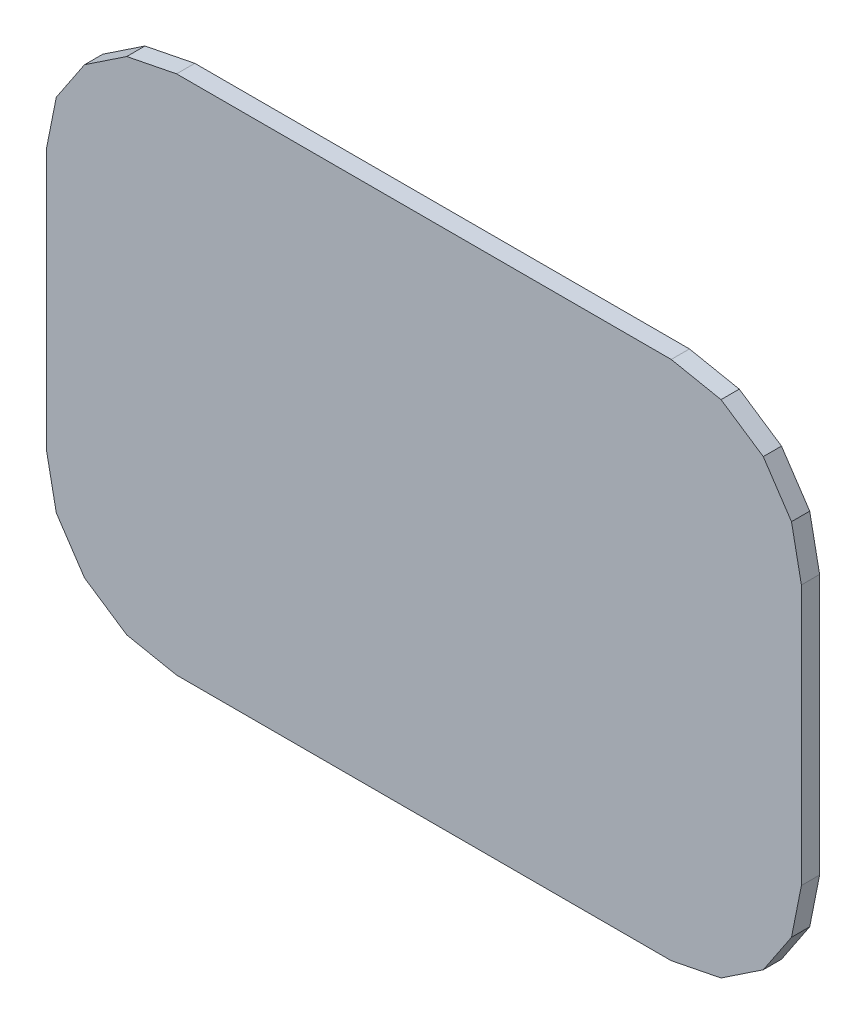
ISO-10303-21;
HEADER;
FILE_DESCRIPTION(('STEP AP214'),'2;1');
FILE_NAME('part.step','',(''),(''),'','','');
FILE_SCHEMA(('AUTOMOTIVE_DESIGN { 1 0 10303 214 1 1 1 1 }'));
ENDSEC;
DATA;
#1=APPLICATION_CONTEXT('core data for automotive mechanical design processes');
#2=APPLICATION_PROTOCOL_DEFINITION('international standard','automotive_design',2000,#1);
#3=PRODUCT_CONTEXT('',#1,'mechanical');
#4=PRODUCT('Part','Part','',(#3));
#5=PRODUCT_RELATED_PRODUCT_CATEGORY('part','',(#4));
#6=PRODUCT_DEFINITION_FORMATION('','',#4);
#7=PRODUCT_DEFINITION_CONTEXT('part definition',#1,'design');
#8=PRODUCT_DEFINITION('design','',#6,#7);
#9=PRODUCT_DEFINITION_SHAPE('','',#8);
#10=(LENGTH_UNIT() NAMED_UNIT(*) SI_UNIT(.MILLI.,.METRE.));
#11=(NAMED_UNIT(*) PLANE_ANGLE_UNIT() SI_UNIT($,.RADIAN.));
#12=(NAMED_UNIT(*) SI_UNIT($,.STERADIAN.) SOLID_ANGLE_UNIT());
#13=UNCERTAINTY_MEASURE_WITH_UNIT(LENGTH_MEASURE(1.E-05),#10,'distance_accuracy_value','');
#14=(GEOMETRIC_REPRESENTATION_CONTEXT(3) GLOBAL_UNCERTAINTY_ASSIGNED_CONTEXT((#13)) GLOBAL_UNIT_ASSIGNED_CONTEXT((#10,
#11,#12)) REPRESENTATION_CONTEXT('',''));
#15=CARTESIAN_POINT('',(0.,0.,0.));
#16=DIRECTION('',(0.,0.,1.));
#17=DIRECTION('',(1.,0.,0.));
#18=AXIS2_PLACEMENT_3D('',#15,#16,#17);
#19=CARTESIAN_POINT('',(104.265499,-66.119999,1.635));
#20=DIRECTION('',(0.,0.,-1.));
#21=DIRECTION('',(0.,-1.,0.));
#22=AXIS2_PLACEMENT_3D('',#19,#20,#21);
#23=PLANE('',#22);
#24=DIRECTION('',(0.980785565024887,-0.195088891120977,0.));
#25=VECTOR('',#24,1.);
#26=CARTESIAN_POINT('',(104.740499,-65.619999,1.635));
#27=LINE('',#26,#25);
#28=CARTESIAN_POINT('',(104.740499,-65.619999,1.635));
#29=VERTEX_POINT('',#28);
#30=CARTESIAN_POINT('',(104.83617,-65.639029,1.635));
#31=VERTEX_POINT('',#30);
#32=EDGE_CURVE('E20',#29,#31,#27,.T.);
#33=ORIENTED_EDGE('',*,*,#32,.F.);
#34=DIRECTION('',(1.,0.,0.));
#35=VECTOR('',#34,1.);
#36=CARTESIAN_POINT('',(103.790499,-65.619999,1.635));
#37=LINE('',#36,#35);
#38=CARTESIAN_POINT('',(103.790499,-65.619999,1.635));
#39=VERTEX_POINT('',#38);
#40=EDGE_CURVE('E374',#39,#29,#37,.T.);
#41=ORIENTED_EDGE('',*,*,#40,.F.);
#42=DIRECTION('',(0.980785565024887,0.195088891120977,0.));
#43=VECTOR('',#42,1.);
#44=CARTESIAN_POINT('',(103.694828,-65.639029,1.635));
#45=LINE('',#44,#43);
#46=CARTESIAN_POINT('',(103.694828,-65.639029,1.635));
#47=VERTEX_POINT('',#46);
#48=EDGE_CURVE('E405',#47,#39,#45,.T.);
#49=ORIENTED_EDGE('',*,*,#48,.F.);
#50=DIRECTION('',(0.831471016926906,0.555568130844937,0.));
#51=VECTOR('',#50,1.);
#52=CARTESIAN_POINT('',(103.613722,-65.693222,1.635));
#53=LINE('',#52,#51);
#54=CARTESIAN_POINT('',(103.613722,-65.693222,1.635));
#55=VERTEX_POINT('',#54);
#56=EDGE_CURVE('E393',#55,#47,#53,.T.);
#57=ORIENTED_EDGE('',*,*,#56,.F.);
#58=DIRECTION('',(0.555568130844937,0.831471016926906,0.));
#59=VECTOR('',#58,1.);
#60=CARTESIAN_POINT('',(103.559529,-65.774328,1.635));
#61=LINE('',#60,#59);
#62=CARTESIAN_POINT('',(103.559529,-65.774328,1.635));
#63=VERTEX_POINT('',#62);
#64=EDGE_CURVE('E381',#63,#55,#61,.T.);
#65=ORIENTED_EDGE('',*,*,#64,.F.);
#66=DIRECTION('',(0.195088891120977,0.980785565024887,0.));
#67=VECTOR('',#66,1.);
#68=CARTESIAN_POINT('',(103.540499,-65.869999,1.635));
#69=LINE('',#68,#67);
#70=CARTESIAN_POINT('',(103.540499,-65.869999,1.635));
#71=VERTEX_POINT('',#70);
#72=EDGE_CURVE('E346',#71,#63,#69,.T.);
#73=ORIENTED_EDGE('',*,*,#72,.F.);
#74=DIRECTION('',(0.,1.,0.));
#75=VECTOR('',#74,1.);
#76=CARTESIAN_POINT('',(103.540499,-66.369999,1.635));
#77=LINE('',#76,#75);
#78=CARTESIAN_POINT('',(103.540499,-66.369999,1.635));
#79=VERTEX_POINT('',#78);
#80=EDGE_CURVE('E360',#79,#71,#77,.T.);
#81=ORIENTED_EDGE('',*,*,#80,.F.);
#82=DIRECTION('',(-0.195088891120977,0.980785565024887,0.));
#83=VECTOR('',#82,1.);
#84=CARTESIAN_POINT('',(103.559529,-66.46567,1.635));
#85=LINE('',#84,#83);
#86=CARTESIAN_POINT('',(103.559529,-66.46567,1.635));
#87=VERTEX_POINT('',#86);
#88=EDGE_CURVE('E265',#87,#79,#85,.T.);
#89=ORIENTED_EDGE('',*,*,#88,.F.);
#90=DIRECTION('',(-0.555568130844937,0.831471016926906,0.));
#91=VECTOR('',#90,1.);
#92=CARTESIAN_POINT('',(103.613722,-66.546776,1.635));
#93=LINE('',#92,#91);
#94=CARTESIAN_POINT('',(103.613722,-66.546776,1.635));
#95=VERTEX_POINT('',#94);
#96=EDGE_CURVE('E340',#95,#87,#93,.T.);
#97=ORIENTED_EDGE('',*,*,#96,.F.);
#98=DIRECTION('',(-0.831471016926906,0.555568130844937,0.));
#99=VECTOR('',#98,1.);
#100=CARTESIAN_POINT('',(103.694828,-66.600969,1.635));
#101=LINE('',#100,#99);
#102=CARTESIAN_POINT('',(103.694828,-66.600969,1.635));
#103=VERTEX_POINT('',#102);
#104=EDGE_CURVE('E295',#103,#95,#101,.T.);
#105=ORIENTED_EDGE('',*,*,#104,.F.);
#106=DIRECTION('',(-0.980785565024887,0.195088891120977,0.));
#107=VECTOR('',#106,1.);
#108=CARTESIAN_POINT('',(103.790499,-66.619999,1.635));
#109=LINE('',#108,#107);
#110=CARTESIAN_POINT('',(103.790499,-66.619999,1.635));
#111=VERTEX_POINT('',#110);
#112=EDGE_CURVE('E322',#111,#103,#109,.T.);
#113=ORIENTED_EDGE('',*,*,#112,.F.);
#114=DIRECTION('',(-1.,0.,0.));
#115=VECTOR('',#114,1.);
#116=CARTESIAN_POINT('',(104.740499,-66.619999,1.635));
#117=LINE('',#116,#115);
#118=CARTESIAN_POINT('',(104.740499,-66.619999,1.635));
#119=VERTEX_POINT('',#118);
#120=EDGE_CURVE('E248',#119,#111,#117,.T.);
#121=ORIENTED_EDGE('',*,*,#120,.F.);
#122=DIRECTION('',(-0.980785565024887,-0.195088891120977,0.));
#123=VECTOR('',#122,1.);
#124=CARTESIAN_POINT('',(104.83617,-66.600969,1.635));
#125=LINE('',#124,#123);
#126=CARTESIAN_POINT('',(104.83617,-66.600969,1.635));
#127=VERTEX_POINT('',#126);
#128=EDGE_CURVE('E300',#127,#119,#125,.T.);
#129=ORIENTED_EDGE('',*,*,#128,.F.);
#130=DIRECTION('',(-0.831471016926906,-0.555568130844937,0.));
#131=VECTOR('',#130,1.);
#132=CARTESIAN_POINT('',(104.917276,-66.546776,1.635));
#133=LINE('',#132,#131);
#134=CARTESIAN_POINT('',(104.917276,-66.546776,1.635));
#135=VERTEX_POINT('',#134);
#136=EDGE_CURVE('E275',#135,#127,#133,.T.);
#137=ORIENTED_EDGE('',*,*,#136,.F.);
#138=DIRECTION('',(-0.555568130844937,-0.831471016926906,0.));
#139=VECTOR('',#138,1.);
#140=CARTESIAN_POINT('',(104.971469,-66.46567,1.635));
#141=LINE('',#140,#139);
#142=CARTESIAN_POINT('',(104.971469,-66.46567,1.635));
#143=VERTEX_POINT('',#142);
#144=EDGE_CURVE('E242',#143,#135,#141,.T.);
#145=ORIENTED_EDGE('',*,*,#144,.F.);
#146=DIRECTION('',(-0.195088891120977,-0.980785565024887,0.));
#147=VECTOR('',#146,1.);
#148=CARTESIAN_POINT('',(104.990499,-66.369999,1.635));
#149=LINE('',#148,#147);
#150=CARTESIAN_POINT('',(104.990499,-66.369999,1.635));
#151=VERTEX_POINT('',#150);
#152=EDGE_CURVE('E202',#151,#143,#149,.T.);
#153=ORIENTED_EDGE('',*,*,#152,.F.);
#154=DIRECTION('',(0.,-1.,0.));
#155=VECTOR('',#154,1.);
#156=CARTESIAN_POINT('',(104.990499,-65.869999,1.635));
#157=LINE('',#156,#155);
#158=CARTESIAN_POINT('',(104.990499,-65.869999,1.635));
#159=VERTEX_POINT('',#158);
#160=EDGE_CURVE('E196',#159,#151,#157,.T.);
#161=ORIENTED_EDGE('',*,*,#160,.F.);
#162=DIRECTION('',(0.195088891120977,-0.980785565024887,0.));
#163=VECTOR('',#162,1.);
#164=CARTESIAN_POINT('',(104.971469,-65.774328,1.635));
#165=LINE('',#164,#163);
#166=CARTESIAN_POINT('',(104.971469,-65.774328,1.635));
#167=VERTEX_POINT('',#166);
#168=EDGE_CURVE('E199',#167,#159,#165,.T.);
#169=ORIENTED_EDGE('',*,*,#168,.F.);
#170=DIRECTION('',(0.555568130844937,-0.831471016926906,0.));
#171=VECTOR('',#170,1.);
#172=CARTESIAN_POINT('',(104.917276,-65.693222,1.635));
#173=LINE('',#172,#171);
#174=CARTESIAN_POINT('',(104.917276,-65.693222,1.635));
#175=VERTEX_POINT('',#174);
#176=EDGE_CURVE('E234',#175,#167,#173,.T.);
#177=ORIENTED_EDGE('',*,*,#176,.F.);
#178=DIRECTION('',(0.831471016926906,-0.555568130844937,0.));
#179=VECTOR('',#178,1.);
#180=CARTESIAN_POINT('',(104.83617,-65.639029,1.635));
#181=LINE('',#180,#179);
#182=EDGE_CURVE('E484',#31,#175,#181,.T.);
#183=ORIENTED_EDGE('',*,*,#182,.F.);
#184=EDGE_LOOP('',(#33,#41,#49,#57,#65,#73,#81,#89,#97,#105,#113,#121,#129,#137,#145,#153,#161,
#169,#177,#183));
#185=FACE_BOUND('',#184,.T.);
#186=ADVANCED_FACE('F17',(#185),#23,.F.);
#187=CARTESIAN_POINT('',(104.265499,-66.119999,1.6));
#188=DIRECTION('',(0.,0.,-1.));
#189=DIRECTION('',(0.,-1.,0.));
#190=AXIS2_PLACEMENT_3D('',#187,#188,#189);
#191=PLANE('',#190);
#192=DIRECTION('',(0.831471016926906,-0.555568130844937,0.));
#193=VECTOR('',#192,1.);
#194=CARTESIAN_POINT('',(104.83617,-65.639029,1.6));
#195=LINE('',#194,#193);
#196=CARTESIAN_POINT('',(104.83617,-65.639029,1.6));
#197=VERTEX_POINT('',#196);
#198=CARTESIAN_POINT('',(104.917276,-65.693222,1.6));
#199=VERTEX_POINT('',#198);
#200=EDGE_CURVE('E469',#197,#199,#195,.T.);
#201=ORIENTED_EDGE('',*,*,#200,.T.);
#202=DIRECTION('',(0.555568130844937,-0.831471016926906,0.));
#203=VECTOR('',#202,1.);
#204=CARTESIAN_POINT('',(104.917276,-65.693222,1.6));
#205=LINE('',#204,#203);
#206=CARTESIAN_POINT('',(104.971469,-65.774328,1.6));
#207=VERTEX_POINT('',#206);
#208=EDGE_CURVE('E224',#199,#207,#205,.T.);
#209=ORIENTED_EDGE('',*,*,#208,.T.);
#210=DIRECTION('',(0.195088891120977,-0.980785565024887,0.));
#211=VECTOR('',#210,1.);
#212=CARTESIAN_POINT('',(104.971469,-65.774328,1.6));
#213=LINE('',#212,#211);
#214=CARTESIAN_POINT('',(104.990499,-65.869999,1.6));
#215=VERTEX_POINT('',#214);
#216=EDGE_CURVE('E208',#207,#215,#213,.T.);
#217=ORIENTED_EDGE('',*,*,#216,.T.);
#218=DIRECTION('',(0.,-1.,0.));
#219=VECTOR('',#218,1.);
#220=CARTESIAN_POINT('',(104.990499,-65.869999,1.6));
#221=LINE('',#220,#219);
#222=CARTESIAN_POINT('',(104.990499,-66.369999,1.6));
#223=VERTEX_POINT('',#222);
#224=EDGE_CURVE('E214',#215,#223,#221,.T.);
#225=ORIENTED_EDGE('',*,*,#224,.T.);
#226=DIRECTION('',(-0.195088891120977,-0.980785565024887,0.));
#227=VECTOR('',#226,1.);
#228=CARTESIAN_POINT('',(104.990499,-66.369999,1.6));
#229=LINE('',#228,#227);
#230=CARTESIAN_POINT('',(104.971469,-66.46567,1.6));
#231=VERTEX_POINT('',#230);
#232=EDGE_CURVE('E238',#223,#231,#229,.T.);
#233=ORIENTED_EDGE('',*,*,#232,.T.);
#234=DIRECTION('',(-0.555568130844937,-0.831471016926906,0.));
#235=VECTOR('',#234,1.);
#236=CARTESIAN_POINT('',(104.971469,-66.46567,1.6));
#237=LINE('',#236,#235);
#238=CARTESIAN_POINT('',(104.917276,-66.546776,1.6));
#239=VERTEX_POINT('',#238);
#240=EDGE_CURVE('E271',#231,#239,#237,.T.);
#241=ORIENTED_EDGE('',*,*,#240,.T.);
#242=DIRECTION('',(-0.831471016926906,-0.555568130844937,0.));
#243=VECTOR('',#242,1.);
#244=CARTESIAN_POINT('',(104.917276,-66.546776,1.6));
#245=LINE('',#244,#243);
#246=CARTESIAN_POINT('',(104.83617,-66.600969,1.6));
#247=VERTEX_POINT('',#246);
#248=EDGE_CURVE('E286',#239,#247,#245,.T.);
#249=ORIENTED_EDGE('',*,*,#248,.T.);
#250=DIRECTION('',(-0.980785565024887,-0.195088891120977,0.));
#251=VECTOR('',#250,1.);
#252=CARTESIAN_POINT('',(104.83617,-66.600969,1.6));
#253=LINE('',#252,#251);
#254=CARTESIAN_POINT('',(104.740499,-66.619999,1.6));
#255=VERTEX_POINT('',#254);
#256=EDGE_CURVE('E244',#247,#255,#253,.T.);
#257=ORIENTED_EDGE('',*,*,#256,.T.);
#258=DIRECTION('',(-1.,0.,0.));
#259=VECTOR('',#258,1.);
#260=CARTESIAN_POINT('',(104.740499,-66.619999,1.6));
#261=LINE('',#260,#259);
#262=CARTESIAN_POINT('',(103.790499,-66.619999,1.6));
#263=VERTEX_POINT('',#262);
#264=EDGE_CURVE('E318',#255,#263,#261,.T.);
#265=ORIENTED_EDGE('',*,*,#264,.T.);
#266=DIRECTION('',(-0.980785565024887,0.195088891120977,0.));
#267=VECTOR('',#266,1.);
#268=CARTESIAN_POINT('',(103.790499,-66.619999,1.6));
#269=LINE('',#268,#267);
#270=CARTESIAN_POINT('',(103.694828,-66.600969,1.6));
#271=VERTEX_POINT('',#270);
#272=EDGE_CURVE('E291',#263,#271,#269,.T.);
#273=ORIENTED_EDGE('',*,*,#272,.T.);
#274=DIRECTION('',(-0.831471016926906,0.555568130844937,0.));
#275=VECTOR('',#274,1.);
#276=CARTESIAN_POINT('',(103.694828,-66.600969,1.6));
#277=LINE('',#276,#275);
#278=CARTESIAN_POINT('',(103.613722,-66.546776,1.6));
#279=VERTEX_POINT('',#278);
#280=EDGE_CURVE('E332',#271,#279,#277,.T.);
#281=ORIENTED_EDGE('',*,*,#280,.T.);
#282=DIRECTION('',(-0.555568130844937,0.831471016926906,0.));
#283=VECTOR('',#282,1.);
#284=CARTESIAN_POINT('',(103.613722,-66.546776,1.6));
#285=LINE('',#284,#283);
#286=CARTESIAN_POINT('',(103.559529,-66.46567,1.6));
#287=VERTEX_POINT('',#286);
#288=EDGE_CURVE('E270',#279,#287,#285,.T.);
#289=ORIENTED_EDGE('',*,*,#288,.T.);
#290=DIRECTION('',(-0.195088891120977,0.980785565024887,0.));
#291=VECTOR('',#290,1.);
#292=CARTESIAN_POINT('',(103.559529,-66.46567,1.6));
#293=LINE('',#292,#291);
#294=CARTESIAN_POINT('',(103.540499,-66.369999,1.6));
#295=VERTEX_POINT('',#294);
#296=EDGE_CURVE('E290',#287,#295,#293,.T.);
#297=ORIENTED_EDGE('',*,*,#296,.T.);
#298=DIRECTION('',(0.,1.,0.));
#299=VECTOR('',#298,1.);
#300=CARTESIAN_POINT('',(103.540499,-66.369999,1.6));
#301=LINE('',#300,#299);
#302=CARTESIAN_POINT('',(103.540499,-65.869999,1.6));
#303=VERTEX_POINT('',#302);
#304=EDGE_CURVE('E368',#295,#303,#301,.T.);
#305=ORIENTED_EDGE('',*,*,#304,.T.);
#306=DIRECTION('',(0.195088891120977,0.980785565024887,0.));
#307=VECTOR('',#306,1.);
#308=CARTESIAN_POINT('',(103.540499,-65.869999,1.6));
#309=LINE('',#308,#307);
#310=CARTESIAN_POINT('',(103.559529,-65.774328,1.6));
#311=VERTEX_POINT('',#310);
#312=EDGE_CURVE('E345',#303,#311,#309,.T.);
#313=ORIENTED_EDGE('',*,*,#312,.T.);
#314=DIRECTION('',(0.555568130844937,0.831471016926906,0.));
#315=VECTOR('',#314,1.);
#316=CARTESIAN_POINT('',(103.559529,-65.774328,1.6));
#317=LINE('',#316,#315);
#318=CARTESIAN_POINT('',(103.613722,-65.693222,1.6));
#319=VERTEX_POINT('',#318);
#320=EDGE_CURVE('E389',#311,#319,#317,.T.);
#321=ORIENTED_EDGE('',*,*,#320,.T.);
#322=DIRECTION('',(0.831471016926906,0.555568130844937,0.));
#323=VECTOR('',#322,1.);
#324=CARTESIAN_POINT('',(103.613722,-65.693222,1.6));
#325=LINE('',#324,#323);
#326=CARTESIAN_POINT('',(103.694828,-65.639029,1.6));
#327=VERTEX_POINT('',#326);
#328=EDGE_CURVE('E401',#319,#327,#325,.T.);
#329=ORIENTED_EDGE('',*,*,#328,.T.);
#330=DIRECTION('',(0.980785565024887,0.195088891120977,0.));
#331=VECTOR('',#330,1.);
#332=CARTESIAN_POINT('',(103.694828,-65.639029,1.6));
#333=LINE('',#332,#331);
#334=CARTESIAN_POINT('',(103.790499,-65.619999,1.6));
#335=VERTEX_POINT('',#334);
#336=EDGE_CURVE('E413',#327,#335,#333,.T.);
#337=ORIENTED_EDGE('',*,*,#336,.T.);
#338=DIRECTION('',(1.,0.,0.));
#339=VECTOR('',#338,1.);
#340=CARTESIAN_POINT('',(103.790499,-65.619999,1.6));
#341=LINE('',#340,#339);
#342=CARTESIAN_POINT('',(104.740499,-65.619999,1.6));
#343=VERTEX_POINT('',#342);
#344=EDGE_CURVE('E333',#335,#343,#341,.T.);
#345=ORIENTED_EDGE('',*,*,#344,.T.);
#346=DIRECTION('',(0.980785565024887,-0.195088891120977,0.));
#347=VECTOR('',#346,1.);
#348=CARTESIAN_POINT('',(104.740499,-65.619999,1.6));
#349=LINE('',#348,#347);
#350=EDGE_CURVE('E11',#343,#197,#349,.T.);
#351=ORIENTED_EDGE('',*,*,#350,.T.);
#352=EDGE_LOOP('',(#201,#209,#217,#225,#233,#241,#249,#257,#265,#273,#281,#289,#297,#305,#313,
#321,#329,#337,#345,#351));
#353=FACE_BOUND('',#352,.T.);
#354=ADVANCED_FACE('F467',(#353),#191,.T.);
#355=CARTESIAN_POINT('',(104.740499,-65.619999,1.6));
#356=DIRECTION('',(0.195088891120977,0.980785565024887,0.));
#357=DIRECTION('',(0.,0.,-1.));
#358=AXIS2_PLACEMENT_3D('',#355,#356,#357);
#359=PLANE('',#358);
#360=DIRECTION('',(0.,0.,1.));
#361=VECTOR('',#360,1.);
#362=CARTESIAN_POINT('',(104.740499,-65.619999,1.6));
#363=LINE('',#362,#361);
#364=EDGE_CURVE('E336',#343,#29,#363,.T.);
#365=ORIENTED_EDGE('',*,*,#364,.T.);
#366=ORIENTED_EDGE('',*,*,#32,.T.);
#367=DIRECTION('',(0.,0.,1.));
#368=VECTOR('',#367,1.);
#369=CARTESIAN_POINT('',(104.83617,-65.639029,1.6));
#370=LINE('',#369,#368);
#371=EDGE_CURVE('E486',#197,#31,#370,.T.);
#372=ORIENTED_EDGE('',*,*,#371,.F.);
#373=ORIENTED_EDGE('',*,*,#350,.F.);
#374=EDGE_LOOP('',(#365,#366,#372,#373));
#375=FACE_BOUND('',#374,.T.);
#376=ADVANCED_FACE('F495',(#375),#359,.T.);
#377=CARTESIAN_POINT('',(103.790499,-65.619999,1.6));
#378=DIRECTION('',(0.,1.,0.));
#379=DIRECTION('',(1.,0.,0.));
#380=AXIS2_PLACEMENT_3D('',#377,#378,#379);
#381=PLANE('',#380);
#382=DIRECTION('',(0.,0.,1.));
#383=VECTOR('',#382,1.);
#384=CARTESIAN_POINT('',(103.790499,-65.619999,1.6));
#385=LINE('',#384,#383);
#386=EDGE_CURVE('E409',#335,#39,#385,.T.);
#387=ORIENTED_EDGE('',*,*,#386,.T.);
#388=ORIENTED_EDGE('',*,*,#40,.T.);
#389=ORIENTED_EDGE('',*,*,#364,.F.);
#390=ORIENTED_EDGE('',*,*,#344,.F.);
#391=EDGE_LOOP('',(#387,#388,#389,#390));
#392=FACE_BOUND('',#391,.T.);
#393=ADVANCED_FACE('F422',(#392),#381,.T.);
#394=CARTESIAN_POINT('',(103.694828,-65.639029,1.6));
#395=DIRECTION('',(-0.195088891120977,0.980785565024887,0.));
#396=DIRECTION('',(0.,0.,1.));
#397=AXIS2_PLACEMENT_3D('',#394,#395,#396);
#398=PLANE('',#397);
#399=DIRECTION('',(0.,0.,1.));
#400=VECTOR('',#399,1.);
#401=CARTESIAN_POINT('',(103.694828,-65.639029,1.6));
#402=LINE('',#401,#400);
#403=EDGE_CURVE('E397',#327,#47,#402,.T.);
#404=ORIENTED_EDGE('',*,*,#403,.T.);
#405=ORIENTED_EDGE('',*,*,#48,.T.);
#406=ORIENTED_EDGE('',*,*,#386,.F.);
#407=ORIENTED_EDGE('',*,*,#336,.F.);
#408=EDGE_LOOP('',(#404,#405,#406,#407));
#409=FACE_BOUND('',#408,.T.);
#410=ADVANCED_FACE('F426',(#409),#398,.T.);
#411=CARTESIAN_POINT('',(103.613722,-65.693222,1.6));
#412=DIRECTION('',(-0.555568130844937,0.831471016926906,0.));
#413=DIRECTION('',(0.,0.,1.));
#414=AXIS2_PLACEMENT_3D('',#411,#412,#413);
#415=PLANE('',#414);
#416=DIRECTION('',(0.,0.,1.));
#417=VECTOR('',#416,1.);
#418=CARTESIAN_POINT('',(103.613722,-65.693222,1.6));
#419=LINE('',#418,#417);
#420=EDGE_CURVE('E385',#319,#55,#419,.T.);
#421=ORIENTED_EDGE('',*,*,#420,.T.);
#422=ORIENTED_EDGE('',*,*,#56,.T.);
#423=ORIENTED_EDGE('',*,*,#403,.F.);
#424=ORIENTED_EDGE('',*,*,#328,.F.);
#425=EDGE_LOOP('',(#421,#422,#423,#424));
#426=FACE_BOUND('',#425,.T.);
#427=ADVANCED_FACE('F428',(#426),#415,.T.);
#428=CARTESIAN_POINT('',(103.559529,-65.774328,1.6));
#429=DIRECTION('',(-0.831471016926906,0.555568130844937,0.));
#430=DIRECTION('',(0.,0.,1.));
#431=AXIS2_PLACEMENT_3D('',#428,#429,#430);
#432=PLANE('',#431);
#433=DIRECTION('',(0.,0.,1.));
#434=VECTOR('',#433,1.);
#435=CARTESIAN_POINT('',(103.559529,-65.774328,1.6));
#436=LINE('',#435,#434);
#437=EDGE_CURVE('E341',#311,#63,#436,.T.);
#438=ORIENTED_EDGE('',*,*,#437,.T.);
#439=ORIENTED_EDGE('',*,*,#64,.T.);
#440=ORIENTED_EDGE('',*,*,#420,.F.);
#441=ORIENTED_EDGE('',*,*,#320,.F.);
#442=EDGE_LOOP('',(#438,#439,#440,#441));
#443=FACE_BOUND('',#442,.T.);
#444=ADVANCED_FACE('F431',(#443),#432,.T.);
#445=CARTESIAN_POINT('',(103.540499,-65.869999,1.6));
#446=DIRECTION('',(-0.980785565024887,0.195088891120977,0.));
#447=DIRECTION('',(0.,0.,1.));
#448=AXIS2_PLACEMENT_3D('',#445,#446,#447);
#449=PLANE('',#448);
#450=DIRECTION('',(0.,0.,1.));
#451=VECTOR('',#450,1.);
#452=CARTESIAN_POINT('',(103.540499,-65.869999,1.6));
#453=LINE('',#452,#451);
#454=EDGE_CURVE('E364',#303,#71,#453,.T.);
#455=ORIENTED_EDGE('',*,*,#454,.T.);
#456=ORIENTED_EDGE('',*,*,#72,.T.);
#457=ORIENTED_EDGE('',*,*,#437,.F.);
#458=ORIENTED_EDGE('',*,*,#312,.F.);
#459=EDGE_LOOP('',(#455,#456,#457,#458));
#460=FACE_BOUND('',#459,.T.);
#461=ADVANCED_FACE('F435',(#460),#449,.T.);
#462=CARTESIAN_POINT('',(103.540499,-66.369999,1.6));
#463=DIRECTION('',(-1.,0.,0.));
#464=DIRECTION('',(0.,0.,1.));
#465=AXIS2_PLACEMENT_3D('',#462,#463,#464);
#466=PLANE('',#465);
#467=DIRECTION('',(0.,0.,1.));
#468=VECTOR('',#467,1.);
#469=CARTESIAN_POINT('',(103.540499,-66.369999,1.6));
#470=LINE('',#469,#468);
#471=EDGE_CURVE('E269',#295,#79,#470,.T.);
#472=ORIENTED_EDGE('',*,*,#471,.T.);
#473=ORIENTED_EDGE('',*,*,#80,.T.);
#474=ORIENTED_EDGE('',*,*,#454,.F.);
#475=ORIENTED_EDGE('',*,*,#304,.F.);
#476=EDGE_LOOP('',(#472,#473,#474,#475));
#477=FACE_BOUND('',#476,.T.);
#478=ADVANCED_FACE('F437',(#477),#466,.T.);
#479=CARTESIAN_POINT('',(103.559529,-66.46567,1.6));
#480=DIRECTION('',(-0.980785565024887,-0.195088891120977,0.));
#481=DIRECTION('',(-0.195088891120977,0.980785565024887,0.));
#482=AXIS2_PLACEMENT_3D('',#479,#480,#481);
#483=PLANE('',#482);
#484=DIRECTION('',(0.,0.,1.));
#485=VECTOR('',#484,1.);
#486=CARTESIAN_POINT('',(103.559529,-66.46567,1.6));
#487=LINE('',#486,#485);
#488=EDGE_CURVE('E350',#287,#87,#487,.T.);
#489=ORIENTED_EDGE('',*,*,#488,.T.);
#490=ORIENTED_EDGE('',*,*,#88,.T.);
#491=ORIENTED_EDGE('',*,*,#471,.F.);
#492=ORIENTED_EDGE('',*,*,#296,.F.);
#493=EDGE_LOOP('',(#489,#490,#491,#492));
#494=FACE_BOUND('',#493,.T.);
#495=ADVANCED_FACE('F440',(#494),#483,.T.);
#496=CARTESIAN_POINT('',(103.613722,-66.546776,1.6));
#497=DIRECTION('',(-0.831471016926906,-0.555568130844937,0.));
#498=DIRECTION('',(-0.555568130844937,0.831471016926906,0.));
#499=AXIS2_PLACEMENT_3D('',#496,#497,#498);
#500=PLANE('',#499);
#501=DIRECTION('',(0.,0.,1.));
#502=VECTOR('',#501,1.);
#503=CARTESIAN_POINT('',(103.613722,-66.546776,1.6));
#504=LINE('',#503,#502);
#505=EDGE_CURVE('E304',#279,#95,#504,.T.);
#506=ORIENTED_EDGE('',*,*,#505,.T.);
#507=ORIENTED_EDGE('',*,*,#96,.T.);
#508=ORIENTED_EDGE('',*,*,#488,.F.);
#509=ORIENTED_EDGE('',*,*,#288,.F.);
#510=EDGE_LOOP('',(#506,#507,#508,#509));
#511=FACE_BOUND('',#510,.T.);
#512=ADVANCED_FACE('F444',(#511),#500,.T.);
#513=CARTESIAN_POINT('',(103.694828,-66.600969,1.6));
#514=DIRECTION('',(-0.555568130844937,-0.831471016926906,0.));
#515=DIRECTION('',(-0.831471016926906,0.555568130844937,0.));
#516=AXIS2_PLACEMENT_3D('',#513,#514,#515);
#517=PLANE('',#516);
#518=DIRECTION('',(0.,0.,1.));
#519=VECTOR('',#518,1.);
#520=CARTESIAN_POINT('',(103.694828,-66.600969,1.6));
#521=LINE('',#520,#519);
#522=EDGE_CURVE('E296',#271,#103,#521,.T.);
#523=ORIENTED_EDGE('',*,*,#522,.T.);
#524=ORIENTED_EDGE('',*,*,#104,.T.);
#525=ORIENTED_EDGE('',*,*,#505,.F.);
#526=ORIENTED_EDGE('',*,*,#280,.F.);
#527=EDGE_LOOP('',(#523,#524,#525,#526));
#528=FACE_BOUND('',#527,.T.);
#529=ADVANCED_FACE('F446',(#528),#517,.T.);
#530=CARTESIAN_POINT('',(103.790499,-66.619999,1.6));
#531=DIRECTION('',(-0.195088891120977,-0.980785565024887,0.));
#532=DIRECTION('',(-0.980785565024887,0.195088891120977,0.));
#533=AXIS2_PLACEMENT_3D('',#530,#531,#532);
#534=PLANE('',#533);
#535=DIRECTION('',(0.,0.,1.));
#536=VECTOR('',#535,1.);
#537=CARTESIAN_POINT('',(103.790499,-66.619999,1.6));
#538=LINE('',#537,#536);
#539=EDGE_CURVE('E314',#263,#111,#538,.T.);
#540=ORIENTED_EDGE('',*,*,#539,.T.);
#541=ORIENTED_EDGE('',*,*,#112,.T.);
#542=ORIENTED_EDGE('',*,*,#522,.F.);
#543=ORIENTED_EDGE('',*,*,#272,.F.);
#544=EDGE_LOOP('',(#540,#541,#542,#543));
#545=FACE_BOUND('',#544,.T.);
#546=ADVANCED_FACE('F449',(#545),#534,.T.);
#547=CARTESIAN_POINT('',(104.740499,-66.619999,1.6));
#548=DIRECTION('',(0.,-1.,0.));
#549=DIRECTION('',(0.,0.,-1.));
#550=AXIS2_PLACEMENT_3D('',#547,#548,#549);
#551=PLANE('',#550);
#552=DIRECTION('',(0.,0.,1.));
#553=VECTOR('',#552,1.);
#554=CARTESIAN_POINT('',(104.740499,-66.619999,1.6));
#555=LINE('',#554,#553);
#556=EDGE_CURVE('E249',#255,#119,#555,.T.);
#557=ORIENTED_EDGE('',*,*,#556,.T.);
#558=ORIENTED_EDGE('',*,*,#120,.T.);
#559=ORIENTED_EDGE('',*,*,#539,.F.);
#560=ORIENTED_EDGE('',*,*,#264,.F.);
#561=EDGE_LOOP('',(#557,#558,#559,#560));
#562=FACE_BOUND('',#561,.T.);
#563=ADVANCED_FACE('F453',(#562),#551,.T.);
#564=CARTESIAN_POINT('',(104.83617,-66.600969,1.6));
#565=DIRECTION('',(0.195088891120977,-0.980785565024887,0.));
#566=DIRECTION('',(0.,0.,-1.));
#567=AXIS2_PLACEMENT_3D('',#564,#565,#566);
#568=PLANE('',#567);
#569=DIRECTION('',(0.,0.,1.));
#570=VECTOR('',#569,1.);
#571=CARTESIAN_POINT('',(104.83617,-66.600969,1.6));
#572=LINE('',#571,#570);
#573=EDGE_CURVE('E282',#247,#127,#572,.T.);
#574=ORIENTED_EDGE('',*,*,#573,.T.);
#575=ORIENTED_EDGE('',*,*,#128,.T.);
#576=ORIENTED_EDGE('',*,*,#556,.F.);
#577=ORIENTED_EDGE('',*,*,#256,.F.);
#578=EDGE_LOOP('',(#574,#575,#576,#577));
#579=FACE_BOUND('',#578,.T.);
#580=ADVANCED_FACE('F455',(#579),#568,.T.);
#581=CARTESIAN_POINT('',(104.917276,-66.546776,1.6));
#582=DIRECTION('',(0.555568130844937,-0.831471016926906,0.));
#583=DIRECTION('',(0.,0.,-1.));
#584=AXIS2_PLACEMENT_3D('',#581,#582,#583);
#585=PLANE('',#584);
#586=DIRECTION('',(0.,0.,1.));
#587=VECTOR('',#586,1.);
#588=CARTESIAN_POINT('',(104.917276,-66.546776,1.6));
#589=LINE('',#588,#587);
#590=EDGE_CURVE('E264',#239,#135,#589,.T.);
#591=ORIENTED_EDGE('',*,*,#590,.T.);
#592=ORIENTED_EDGE('',*,*,#136,.T.);
#593=ORIENTED_EDGE('',*,*,#573,.F.);
#594=ORIENTED_EDGE('',*,*,#248,.F.);
#595=EDGE_LOOP('',(#591,#592,#593,#594));
#596=FACE_BOUND('',#595,.T.);
#597=ADVANCED_FACE('F458',(#596),#585,.T.);
#598=CARTESIAN_POINT('',(104.971469,-66.46567,1.6));
#599=DIRECTION('',(0.831471016926906,-0.555568130844937,0.));
#600=DIRECTION('',(0.,0.,-1.));
#601=AXIS2_PLACEMENT_3D('',#598,#599,#600);
#602=PLANE('',#601);
#603=DIRECTION('',(0.,0.,1.));
#604=VECTOR('',#603,1.);
#605=CARTESIAN_POINT('',(104.971469,-66.46567,1.6));
#606=LINE('',#605,#604);
#607=EDGE_CURVE('E243',#231,#143,#606,.T.);
#608=ORIENTED_EDGE('',*,*,#607,.T.);
#609=ORIENTED_EDGE('',*,*,#144,.T.);
#610=ORIENTED_EDGE('',*,*,#590,.F.);
#611=ORIENTED_EDGE('',*,*,#240,.F.);
#612=EDGE_LOOP('',(#608,#609,#610,#611));
#613=FACE_BOUND('',#612,.T.);
#614=ADVANCED_FACE('F462',(#613),#602,.T.);
#615=CARTESIAN_POINT('',(104.990499,-66.369999,1.6));
#616=DIRECTION('',(0.980785565024887,-0.195088891120977,0.));
#617=DIRECTION('',(0.,0.,-1.));
#618=AXIS2_PLACEMENT_3D('',#615,#616,#617);
#619=PLANE('',#618);
#620=DIRECTION('',(0.,0.,1.));
#621=VECTOR('',#620,1.);
#622=CARTESIAN_POINT('',(104.990499,-66.369999,1.6));
#623=LINE('',#622,#621);
#624=EDGE_CURVE('E207',#223,#151,#623,.T.);
#625=ORIENTED_EDGE('',*,*,#624,.T.);
#626=ORIENTED_EDGE('',*,*,#152,.T.);
#627=ORIENTED_EDGE('',*,*,#607,.F.);
#628=ORIENTED_EDGE('',*,*,#232,.F.);
#629=EDGE_LOOP('',(#625,#626,#627,#628));
#630=FACE_BOUND('',#629,.T.);
#631=ADVANCED_FACE('F464',(#630),#619,.T.);
#632=CARTESIAN_POINT('',(104.990499,-65.869999,1.6));
#633=DIRECTION('',(1.,0.,0.));
#634=DIRECTION('',(0.,1.,0.));
#635=AXIS2_PLACEMENT_3D('',#632,#633,#634);
#636=PLANE('',#635);
#637=DIRECTION('',(0.,0.,1.));
#638=VECTOR('',#637,1.);
#639=CARTESIAN_POINT('',(104.990499,-65.869999,1.6));
#640=LINE('',#639,#638);
#641=EDGE_CURVE('E211',#215,#159,#640,.T.);
#642=ORIENTED_EDGE('',*,*,#641,.T.);
#643=ORIENTED_EDGE('',*,*,#160,.T.);
#644=ORIENTED_EDGE('',*,*,#624,.F.);
#645=ORIENTED_EDGE('',*,*,#224,.F.);
#646=EDGE_LOOP('',(#642,#643,#644,#645));
#647=FACE_BOUND('',#646,.T.);
#648=ADVANCED_FACE('F212',(#647),#636,.T.);
#649=CARTESIAN_POINT('',(104.971469,-65.774328,1.6));
#650=DIRECTION('',(0.980785565024887,0.195088891120977,0.));
#651=DIRECTION('',(0.,0.,-1.));
#652=AXIS2_PLACEMENT_3D('',#649,#650,#651);
#653=PLANE('',#652);
#654=DIRECTION('',(0.,0.,1.));
#655=VECTOR('',#654,1.);
#656=CARTESIAN_POINT('',(104.971469,-65.774328,1.6));
#657=LINE('',#656,#655);
#658=EDGE_CURVE('E221',#207,#167,#657,.T.);
#659=ORIENTED_EDGE('',*,*,#658,.T.);
#660=ORIENTED_EDGE('',*,*,#168,.T.);
#661=ORIENTED_EDGE('',*,*,#641,.F.);
#662=ORIENTED_EDGE('',*,*,#216,.F.);
#663=EDGE_LOOP('',(#659,#660,#661,#662));
#664=FACE_BOUND('',#663,.T.);
#665=ADVANCED_FACE('F219',(#664),#653,.T.);
#666=CARTESIAN_POINT('',(104.917276,-65.693222,1.6));
#667=DIRECTION('',(0.831471016926906,0.555568130844937,0.));
#668=DIRECTION('',(0.,0.,-1.));
#669=AXIS2_PLACEMENT_3D('',#666,#667,#668);
#670=PLANE('',#669);
#671=DIRECTION('',(0.,0.,1.));
#672=VECTOR('',#671,1.);
#673=CARTESIAN_POINT('',(104.917276,-65.693222,1.6));
#674=LINE('',#673,#672);
#675=EDGE_CURVE('E474',#199,#175,#674,.T.);
#676=ORIENTED_EDGE('',*,*,#675,.T.);
#677=ORIENTED_EDGE('',*,*,#176,.T.);
#678=ORIENTED_EDGE('',*,*,#658,.F.);
#679=ORIENTED_EDGE('',*,*,#208,.F.);
#680=EDGE_LOOP('',(#676,#677,#678,#679));
#681=FACE_BOUND('',#680,.T.);
#682=ADVANCED_FACE('F473',(#681),#670,.T.);
#683=CARTESIAN_POINT('',(104.83617,-65.639029,1.6));
#684=DIRECTION('',(0.555568130844937,0.831471016926906,0.));
#685=DIRECTION('',(0.,0.,-1.));
#686=AXIS2_PLACEMENT_3D('',#683,#684,#685);
#687=PLANE('',#686);
#688=ORIENTED_EDGE('',*,*,#371,.T.);
#689=ORIENTED_EDGE('',*,*,#182,.T.);
#690=ORIENTED_EDGE('',*,*,#675,.F.);
#691=ORIENTED_EDGE('',*,*,#200,.F.);
#692=EDGE_LOOP('',(#688,#689,#690,#691));
#693=FACE_BOUND('',#692,.T.);
#694=ADVANCED_FACE('F494',(#693),#687,.T.);
#695=CLOSED_SHELL('',(#186,#354,#376,#393,#410,#427,#444,#461,#478,#495,#512,#529,#546,#563,
#580,#597,#614,#631,#648,#665,#682,#694));
#696=MANIFOLD_SOLID_BREP('B1',#695);
#697=ADVANCED_BREP_SHAPE_REPRESENTATION('',(#18,#696),#14);
#698=SHAPE_DEFINITION_REPRESENTATION(#9,#697);
ENDSEC;
END-ISO-10303-21;
